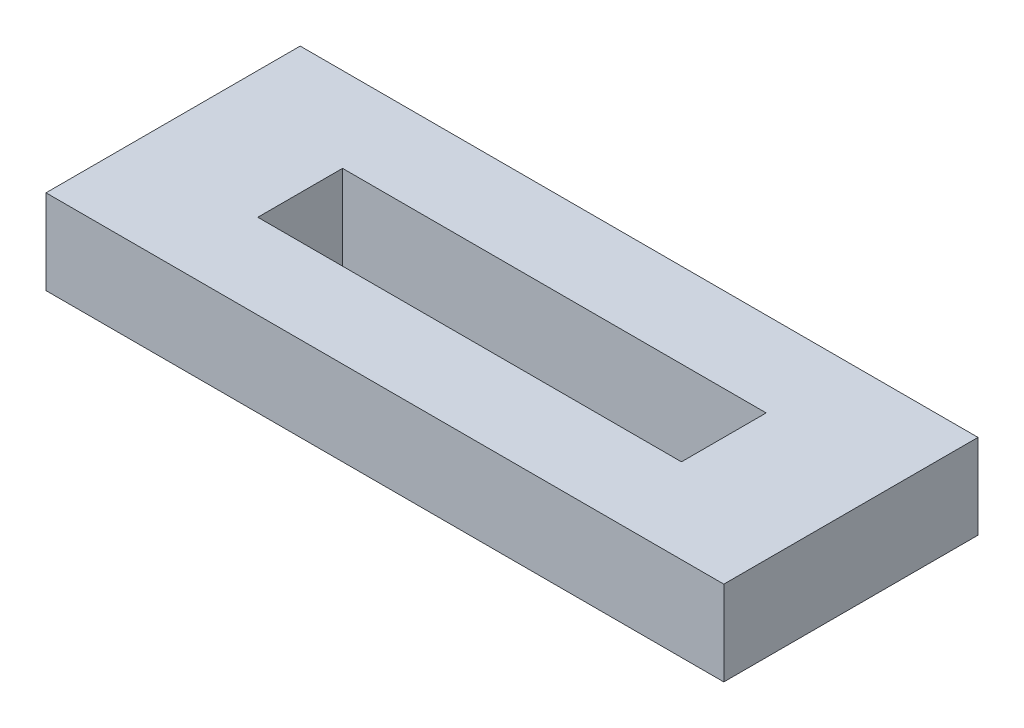
ISO-10303-21;
HEADER;
FILE_DESCRIPTION(('STEP AP214'),'2;1');
FILE_NAME('part.step','',(''),(''),'','','');
FILE_SCHEMA(('AUTOMOTIVE_DESIGN { 1 0 10303 214 1 1 1 1 }'));
ENDSEC;
DATA;
#1=APPLICATION_CONTEXT('core data for automotive mechanical design processes');
#2=APPLICATION_PROTOCOL_DEFINITION('international standard','automotive_design',2000,#1);
#3=PRODUCT_CONTEXT('',#1,'mechanical');
#4=PRODUCT('Part','Part','',(#3));
#5=PRODUCT_RELATED_PRODUCT_CATEGORY('part','',(#4));
#6=PRODUCT_DEFINITION_FORMATION('','',#4);
#7=PRODUCT_DEFINITION_CONTEXT('part definition',#1,'design');
#8=PRODUCT_DEFINITION('design','',#6,#7);
#9=PRODUCT_DEFINITION_SHAPE('','',#8);
#10=(LENGTH_UNIT() NAMED_UNIT(*) SI_UNIT(.MILLI.,.METRE.));
#11=(NAMED_UNIT(*) PLANE_ANGLE_UNIT() SI_UNIT($,.RADIAN.));
#12=(NAMED_UNIT(*) SI_UNIT($,.STERADIAN.) SOLID_ANGLE_UNIT());
#13=UNCERTAINTY_MEASURE_WITH_UNIT(LENGTH_MEASURE(1.E-05),#10,'distance_accuracy_value','');
#14=(GEOMETRIC_REPRESENTATION_CONTEXT(3) GLOBAL_UNCERTAINTY_ASSIGNED_CONTEXT((#13)) GLOBAL_UNIT_ASSIGNED_CONTEXT((#10,
#11,#12)) REPRESENTATION_CONTEXT('',''));
#15=CARTESIAN_POINT('',(0.,0.,0.));
#16=DIRECTION('',(0.,0.,1.));
#17=DIRECTION('',(1.,0.,0.));
#18=AXIS2_PLACEMENT_3D('',#15,#16,#17);
#19=CARTESIAN_POINT('',(0.,10.,0.));
#20=DIRECTION('',(0.,1.,0.));
#21=DIRECTION('',(0.,0.,1.));
#22=AXIS2_PLACEMENT_3D('',#19,#20,#21);
#23=PLANE('',#22);
#24=DIRECTION('',(0.,0.,-1.));
#25=VECTOR('',#24,1.);
#26=CARTESIAN_POINT('',(40.,10.,-15.));
#27=LINE('',#26,#25);
#28=CARTESIAN_POINT('',(40.,10.,15.));
#29=VERTEX_POINT('',#28);
#30=CARTESIAN_POINT('',(40.,10.,-15.));
#31=VERTEX_POINT('',#30);
#32=EDGE_CURVE('E153',#29,#31,#27,.T.);
#33=ORIENTED_EDGE('',*,*,#32,.T.);
#34=DIRECTION('',(-1.,0.,0.));
#35=VECTOR('',#34,1.);
#36=CARTESIAN_POINT('',(-40.,10.,-15.));
#37=LINE('',#36,#35);
#38=CARTESIAN_POINT('',(-40.,10.,-15.));
#39=VERTEX_POINT('',#38);
#40=EDGE_CURVE('E157',#31,#39,#37,.T.);
#41=ORIENTED_EDGE('',*,*,#40,.T.);
#42=DIRECTION('',(0.,0.,1.));
#43=VECTOR('',#42,1.);
#44=CARTESIAN_POINT('',(-40.,10.,-15.));
#45=LINE('',#44,#43);
#46=CARTESIAN_POINT('',(-40.,10.,15.));
#47=VERTEX_POINT('',#46);
#48=EDGE_CURVE('E161',#39,#47,#45,.T.);
#49=ORIENTED_EDGE('',*,*,#48,.T.);
#50=DIRECTION('',(1.,0.,0.));
#51=VECTOR('',#50,1.);
#52=CARTESIAN_POINT('',(-40.,10.,15.));
#53=LINE('',#52,#51);
#54=EDGE_CURVE('E164',#47,#29,#53,.T.);
#55=ORIENTED_EDGE('',*,*,#54,.T.);
#56=EDGE_LOOP('',(#33,#41,#49,#55));
#57=FACE_BOUND('',#56,.T.);
#58=DIRECTION('',(-1.,0.,0.));
#59=VECTOR('',#58,1.);
#60=CARTESIAN_POINT('',(-25.,10.,-5.));
#61=LINE('',#60,#59);
#62=CARTESIAN_POINT('',(25.,10.,-5.));
#63=VERTEX_POINT('',#62);
#64=CARTESIAN_POINT('',(-25.,10.,-5.));
#65=VERTEX_POINT('',#64);
#66=EDGE_CURVE('E114',#63,#65,#61,.T.);
#67=ORIENTED_EDGE('',*,*,#66,.F.);
#68=DIRECTION('',(0.,0.,-1.));
#69=VECTOR('',#68,1.);
#70=CARTESIAN_POINT('',(25.,10.,-5.));
#71=LINE('',#70,#69);
#72=CARTESIAN_POINT('',(25.,10.,5.));
#73=VERTEX_POINT('',#72);
#74=EDGE_CURVE('E105',#73,#63,#71,.T.);
#75=ORIENTED_EDGE('',*,*,#74,.F.);
#76=DIRECTION('',(1.,0.,0.));
#77=VECTOR('',#76,1.);
#78=CARTESIAN_POINT('',(-25.,10.,5.));
#79=LINE('',#78,#77);
#80=CARTESIAN_POINT('',(-25.,10.,5.));
#81=VERTEX_POINT('',#80);
#82=EDGE_CURVE('E131',#81,#73,#79,.T.);
#83=ORIENTED_EDGE('',*,*,#82,.F.);
#84=DIRECTION('',(0.,0.,1.));
#85=VECTOR('',#84,1.);
#86=CARTESIAN_POINT('',(-25.,10.,-5.));
#87=LINE('',#86,#85);
#88=EDGE_CURVE('E127',#65,#81,#87,.T.);
#89=ORIENTED_EDGE('',*,*,#88,.F.);
#90=EDGE_LOOP('',(#67,#75,#83,#89));
#91=FACE_BOUND('',#90,.T.);
#92=ADVANCED_FACE('F39',(#57,#91),#23,.T.);
#93=CARTESIAN_POINT('',(0.,0.,0.));
#94=DIRECTION('',(0.,1.,0.));
#95=DIRECTION('',(0.,0.,1.));
#96=AXIS2_PLACEMENT_3D('',#93,#94,#95);
#97=PLANE('',#96);
#98=DIRECTION('',(0.,0.,-1.));
#99=VECTOR('',#98,1.);
#100=CARTESIAN_POINT('',(40.,0.,-15.));
#101=LINE('',#100,#99);
#102=CARTESIAN_POINT('',(40.,0.,15.));
#103=VERTEX_POINT('',#102);
#104=CARTESIAN_POINT('',(40.,0.,-15.));
#105=VERTEX_POINT('',#104);
#106=EDGE_CURVE('E123',#103,#105,#101,.T.);
#107=ORIENTED_EDGE('',*,*,#106,.F.);
#108=DIRECTION('',(1.,0.,0.));
#109=VECTOR('',#108,1.);
#110=CARTESIAN_POINT('',(-40.,0.,15.));
#111=LINE('',#110,#109);
#112=CARTESIAN_POINT('',(-40.,0.,15.));
#113=VERTEX_POINT('',#112);
#114=EDGE_CURVE('E158',#113,#103,#111,.T.);
#115=ORIENTED_EDGE('',*,*,#114,.F.);
#116=DIRECTION('',(0.,0.,1.));
#117=VECTOR('',#116,1.);
#118=CARTESIAN_POINT('',(-40.,0.,-15.));
#119=LINE('',#118,#117);
#120=CARTESIAN_POINT('',(-40.,0.,-15.));
#121=VERTEX_POINT('',#120);
#122=EDGE_CURVE('E174',#121,#113,#119,.T.);
#123=ORIENTED_EDGE('',*,*,#122,.F.);
#124=DIRECTION('',(-1.,0.,0.));
#125=VECTOR('',#124,1.);
#126=CARTESIAN_POINT('',(-40.,0.,-15.));
#127=LINE('',#126,#125);
#128=EDGE_CURVE('E171',#105,#121,#127,.T.);
#129=ORIENTED_EDGE('',*,*,#128,.F.);
#130=EDGE_LOOP('',(#107,#115,#123,#129));
#131=FACE_BOUND('',#130,.T.);
#132=DIRECTION('',(0.,0.,-1.));
#133=VECTOR('',#132,1.);
#134=CARTESIAN_POINT('',(25.,0.,-5.));
#135=LINE('',#134,#133);
#136=CARTESIAN_POINT('',(25.,0.,5.));
#137=VERTEX_POINT('',#136);
#138=CARTESIAN_POINT('',(25.,0.,-5.));
#139=VERTEX_POINT('',#138);
#140=EDGE_CURVE('E63',#137,#139,#135,.T.);
#141=ORIENTED_EDGE('',*,*,#140,.T.);
#142=DIRECTION('',(-1.,0.,0.));
#143=VECTOR('',#142,1.);
#144=CARTESIAN_POINT('',(-25.,0.,-5.));
#145=LINE('',#144,#143);
#146=CARTESIAN_POINT('',(-25.,0.,-5.));
#147=VERTEX_POINT('',#146);
#148=EDGE_CURVE('E121',#139,#147,#145,.T.);
#149=ORIENTED_EDGE('',*,*,#148,.T.);
#150=DIRECTION('',(0.,0.,1.));
#151=VECTOR('',#150,1.);
#152=CARTESIAN_POINT('',(-25.,0.,-5.));
#153=LINE('',#152,#151);
#154=CARTESIAN_POINT('',(-25.,0.,5.));
#155=VERTEX_POINT('',#154);
#156=EDGE_CURVE('E140',#147,#155,#153,.T.);
#157=ORIENTED_EDGE('',*,*,#156,.T.);
#158=DIRECTION('',(1.,0.,0.));
#159=VECTOR('',#158,1.);
#160=CARTESIAN_POINT('',(-25.,0.,5.));
#161=LINE('',#160,#159);
#162=EDGE_CURVE('E115',#155,#137,#161,.T.);
#163=ORIENTED_EDGE('',*,*,#162,.T.);
#164=EDGE_LOOP('',(#141,#149,#157,#163));
#165=FACE_BOUND('',#164,.T.);
#166=ADVANCED_FACE('F197',(#131,#165),#97,.F.);
#167=CARTESIAN_POINT('',(40.,10.,-15.));
#168=DIRECTION('',(-1.,0.,0.));
#169=DIRECTION('',(0.,0.,1.));
#170=AXIS2_PLACEMENT_3D('',#167,#168,#169);
#171=PLANE('',#170);
#172=ORIENTED_EDGE('',*,*,#106,.T.);
#173=DIRECTION('',(0.,-1.,0.));
#174=VECTOR('',#173,1.);
#175=CARTESIAN_POINT('',(40.,10.,-15.));
#176=LINE('',#175,#174);
#177=EDGE_CURVE('E11',#31,#105,#176,.T.);
#178=ORIENTED_EDGE('',*,*,#177,.F.);
#179=ORIENTED_EDGE('',*,*,#32,.F.);
#180=DIRECTION('',(0.,-1.,0.));
#181=VECTOR('',#180,1.);
#182=CARTESIAN_POINT('',(40.,10.,15.));
#183=LINE('',#182,#181);
#184=EDGE_CURVE('E167',#29,#103,#183,.T.);
#185=ORIENTED_EDGE('',*,*,#184,.T.);
#186=EDGE_LOOP('',(#172,#178,#179,#185));
#187=FACE_BOUND('',#186,.T.);
#188=ADVANCED_FACE('F41',(#187),#171,.F.);
#189=CARTESIAN_POINT('',(-40.,10.,-15.));
#190=DIRECTION('',(0.,0.,1.));
#191=DIRECTION('',(1.,0.,0.));
#192=AXIS2_PLACEMENT_3D('',#189,#190,#191);
#193=PLANE('',#192);
#194=ORIENTED_EDGE('',*,*,#128,.T.);
#195=DIRECTION('',(0.,-1.,0.));
#196=VECTOR('',#195,1.);
#197=CARTESIAN_POINT('',(-40.,10.,-15.));
#198=LINE('',#197,#196);
#199=EDGE_CURVE('E48',#39,#121,#198,.T.);
#200=ORIENTED_EDGE('',*,*,#199,.F.);
#201=ORIENTED_EDGE('',*,*,#40,.F.);
#202=ORIENTED_EDGE('',*,*,#177,.T.);
#203=EDGE_LOOP('',(#194,#200,#201,#202));
#204=FACE_BOUND('',#203,.T.);
#205=ADVANCED_FACE('F207',(#204),#193,.F.);
#206=CARTESIAN_POINT('',(-40.,10.,-15.));
#207=DIRECTION('',(1.,0.,0.));
#208=DIRECTION('',(0.,0.,-1.));
#209=AXIS2_PLACEMENT_3D('',#206,#207,#208);
#210=PLANE('',#209);
#211=ORIENTED_EDGE('',*,*,#122,.T.);
#212=DIRECTION('',(0.,-1.,0.));
#213=VECTOR('',#212,1.);
#214=CARTESIAN_POINT('',(-40.,10.,15.));
#215=LINE('',#214,#213);
#216=EDGE_CURVE('E182',#47,#113,#215,.T.);
#217=ORIENTED_EDGE('',*,*,#216,.F.);
#218=ORIENTED_EDGE('',*,*,#48,.F.);
#219=ORIENTED_EDGE('',*,*,#199,.T.);
#220=EDGE_LOOP('',(#211,#217,#218,#219));
#221=FACE_BOUND('',#220,.T.);
#222=ADVANCED_FACE('F191',(#221),#210,.F.);
#223=CARTESIAN_POINT('',(-40.,10.,15.));
#224=DIRECTION('',(0.,0.,-1.));
#225=DIRECTION('',(-1.,0.,0.));
#226=AXIS2_PLACEMENT_3D('',#223,#224,#225);
#227=PLANE('',#226);
#228=ORIENTED_EDGE('',*,*,#114,.T.);
#229=ORIENTED_EDGE('',*,*,#184,.F.);
#230=ORIENTED_EDGE('',*,*,#54,.F.);
#231=ORIENTED_EDGE('',*,*,#216,.T.);
#232=EDGE_LOOP('',(#228,#229,#230,#231));
#233=FACE_BOUND('',#232,.T.);
#234=ADVANCED_FACE('F201',(#233),#227,.F.);
#235=CARTESIAN_POINT('',(25.,10.,-5.));
#236=DIRECTION('',(-1.,0.,0.));
#237=DIRECTION('',(0.,0.,1.));
#238=AXIS2_PLACEMENT_3D('',#235,#236,#237);
#239=PLANE('',#238);
#240=ORIENTED_EDGE('',*,*,#140,.F.);
#241=DIRECTION('',(0.,-1.,0.));
#242=VECTOR('',#241,1.);
#243=CARTESIAN_POINT('',(25.,10.,5.));
#244=LINE('',#243,#242);
#245=EDGE_CURVE('E109',#73,#137,#244,.T.);
#246=ORIENTED_EDGE('',*,*,#245,.F.);
#247=ORIENTED_EDGE('',*,*,#74,.T.);
#248=DIRECTION('',(0.,-1.,0.));
#249=VECTOR('',#248,1.);
#250=CARTESIAN_POINT('',(25.,10.,-5.));
#251=LINE('',#250,#249);
#252=EDGE_CURVE('E108',#63,#139,#251,.T.);
#253=ORIENTED_EDGE('',*,*,#252,.T.);
#254=EDGE_LOOP('',(#240,#246,#247,#253));
#255=FACE_BOUND('',#254,.T.);
#256=ADVANCED_FACE('F107',(#255),#239,.T.);
#257=CARTESIAN_POINT('',(-25.,10.,-5.));
#258=DIRECTION('',(0.,0.,1.));
#259=DIRECTION('',(1.,0.,0.));
#260=AXIS2_PLACEMENT_3D('',#257,#258,#259);
#261=PLANE('',#260);
#262=ORIENTED_EDGE('',*,*,#148,.F.);
#263=ORIENTED_EDGE('',*,*,#252,.F.);
#264=ORIENTED_EDGE('',*,*,#66,.T.);
#265=DIRECTION('',(0.,-1.,0.));
#266=VECTOR('',#265,1.);
#267=CARTESIAN_POINT('',(-25.,10.,-5.));
#268=LINE('',#267,#266);
#269=EDGE_CURVE('E124',#65,#147,#268,.T.);
#270=ORIENTED_EDGE('',*,*,#269,.T.);
#271=EDGE_LOOP('',(#262,#263,#264,#270));
#272=FACE_BOUND('',#271,.T.);
#273=ADVANCED_FACE('F118',(#272),#261,.T.);
#274=CARTESIAN_POINT('',(-25.,10.,-5.));
#275=DIRECTION('',(1.,0.,0.));
#276=DIRECTION('',(0.,0.,-1.));
#277=AXIS2_PLACEMENT_3D('',#274,#275,#276);
#278=PLANE('',#277);
#279=ORIENTED_EDGE('',*,*,#156,.F.);
#280=ORIENTED_EDGE('',*,*,#269,.F.);
#281=ORIENTED_EDGE('',*,*,#88,.T.);
#282=DIRECTION('',(0.,-1.,0.));
#283=VECTOR('',#282,1.);
#284=CARTESIAN_POINT('',(-25.,10.,5.));
#285=LINE('',#284,#283);
#286=EDGE_CURVE('E55',#81,#155,#285,.T.);
#287=ORIENTED_EDGE('',*,*,#286,.T.);
#288=EDGE_LOOP('',(#279,#280,#281,#287));
#289=FACE_BOUND('',#288,.T.);
#290=ADVANCED_FACE('F230',(#289),#278,.T.);
#291=CARTESIAN_POINT('',(-25.,10.,5.));
#292=DIRECTION('',(0.,0.,-1.));
#293=DIRECTION('',(-1.,0.,0.));
#294=AXIS2_PLACEMENT_3D('',#291,#292,#293);
#295=PLANE('',#294);
#296=ORIENTED_EDGE('',*,*,#162,.F.);
#297=ORIENTED_EDGE('',*,*,#286,.F.);
#298=ORIENTED_EDGE('',*,*,#82,.T.);
#299=ORIENTED_EDGE('',*,*,#245,.T.);
#300=EDGE_LOOP('',(#296,#297,#298,#299));
#301=FACE_BOUND('',#300,.T.);
#302=ADVANCED_FACE('F234',(#301),#295,.T.);
#303=CLOSED_SHELL('',(#92,#166,#188,#205,#222,#234,#256,#273,#290,#302));
#304=MANIFOLD_SOLID_BREP('B2',#303);
#305=ADVANCED_BREP_SHAPE_REPRESENTATION('',(#18,#304),#14);
#306=SHAPE_DEFINITION_REPRESENTATION(#9,#305);
ENDSEC;
END-ISO-10303-21;
